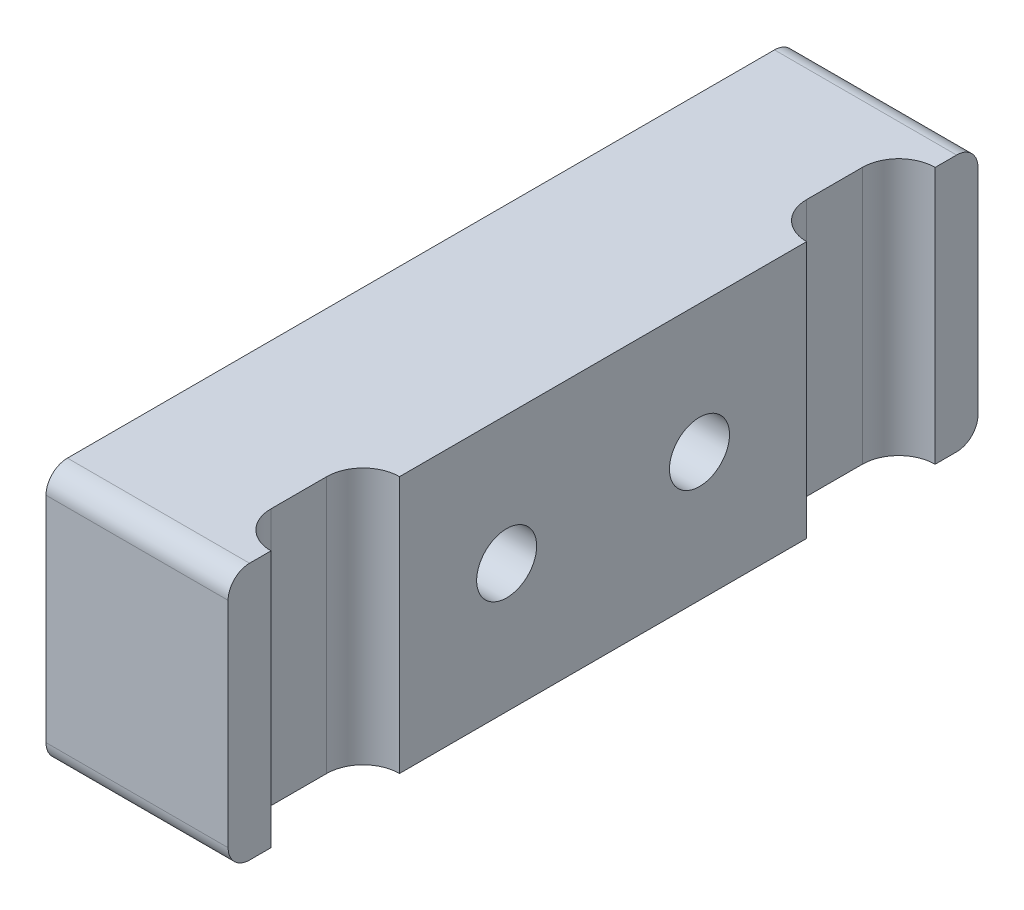
ISO-10303-21;
HEADER;
FILE_DESCRIPTION(('STEP AP214'),'2;1');
FILE_NAME('part.step','',(''),(''),'','','');
FILE_SCHEMA(('AUTOMOTIVE_DESIGN { 1 0 10303 214 1 1 1 1 }'));
ENDSEC;
DATA;
#1=APPLICATION_CONTEXT('core data for automotive mechanical design processes');
#2=APPLICATION_PROTOCOL_DEFINITION('international standard','automotive_design',2000,#1);
#3=PRODUCT_CONTEXT('',#1,'mechanical');
#4=PRODUCT('Part','Part','',(#3));
#5=PRODUCT_RELATED_PRODUCT_CATEGORY('part','',(#4));
#6=PRODUCT_DEFINITION_FORMATION('','',#4);
#7=PRODUCT_DEFINITION_CONTEXT('part definition',#1,'design');
#8=PRODUCT_DEFINITION('design','',#6,#7);
#9=PRODUCT_DEFINITION_SHAPE('','',#8);
#10=(LENGTH_UNIT() NAMED_UNIT(*) SI_UNIT(.MILLI.,.METRE.));
#11=(NAMED_UNIT(*) PLANE_ANGLE_UNIT() SI_UNIT($,.RADIAN.));
#12=(NAMED_UNIT(*) SI_UNIT($,.STERADIAN.) SOLID_ANGLE_UNIT());
#13=UNCERTAINTY_MEASURE_WITH_UNIT(LENGTH_MEASURE(1.E-05),#10,'distance_accuracy_value','');
#14=(GEOMETRIC_REPRESENTATION_CONTEXT(3) GLOBAL_UNCERTAINTY_ASSIGNED_CONTEXT((#13)) GLOBAL_UNIT_ASSIGNED_CONTEXT((#10,
#11,#12)) REPRESENTATION_CONTEXT('',''));
#15=CARTESIAN_POINT('',(0.,0.,0.));
#16=DIRECTION('',(0.,0.,1.));
#17=DIRECTION('',(1.,0.,0.));
#18=AXIS2_PLACEMENT_3D('',#15,#16,#17);
#19=CARTESIAN_POINT('',(0.,12.,-17.5));
#20=DIRECTION('',(1.,0.,0.));
#21=DIRECTION('',(0.,0.,-1.));
#22=AXIS2_PLACEMENT_3D('',#19,#20,#21);
#23=PLANE('',#22);
#24=CARTESIAN_POINT('',(0.,6.,4.5));
#25=DIRECTION('',(1.,0.,0.));
#26=DIRECTION('',(0.,0.,-1.));
#27=AXIS2_PLACEMENT_3D('',#24,#25,#26);
#28=CIRCLE('',#27,1.4);
#29=CARTESIAN_POINT('',(0.,6.,3.1));
#30=VERTEX_POINT('',#29);
#31=EDGE_CURVE('E194',#30,#30,#28,.F.);
#32=ORIENTED_EDGE('',*,*,#31,.F.);
#33=EDGE_LOOP('',(#32));
#34=FACE_BOUND('',#33,.T.);
#35=CARTESIAN_POINT('',(0.,6.,-4.5));
#36=DIRECTION('',(1.,0.,0.));
#37=DIRECTION('',(0.,0.,-1.));
#38=AXIS2_PLACEMENT_3D('',#35,#36,#37);
#39=CIRCLE('',#38,1.4);
#40=CARTESIAN_POINT('',(0.,6.,-5.9));
#41=VERTEX_POINT('',#40);
#42=EDGE_CURVE('E363',#41,#41,#39,.F.);
#43=ORIENTED_EDGE('',*,*,#42,.F.);
#44=EDGE_LOOP('',(#43));
#45=FACE_BOUND('',#44,.T.);
#46=DIRECTION('',(0.,0.,1.));
#47=VECTOR('',#46,1.);
#48=CARTESIAN_POINT('',(0.,12.,-17.5));
#49=LINE('',#48,#47);
#50=CARTESIAN_POINT('',(0.,12.,-16.5));
#51=VERTEX_POINT('',#50);
#52=CARTESIAN_POINT('',(0.,12.,16.5));
#53=VERTEX_POINT('',#52);
#54=EDGE_CURVE('E158',#51,#53,#49,.T.);
#55=ORIENTED_EDGE('',*,*,#54,.F.);
#56=CARTESIAN_POINT('',(0.,11.,-16.5));
#57=DIRECTION('',(1.,0.,0.));
#58=DIRECTION('',(0.,0.,-1.));
#59=AXIS2_PLACEMENT_3D('',#56,#57,#58);
#60=CIRCLE('',#59,1.);
#61=CARTESIAN_POINT('',(0.,11.,-17.5));
#62=VERTEX_POINT('',#61);
#63=EDGE_CURVE('E251',#51,#62,#60,.F.);
#64=ORIENTED_EDGE('',*,*,#63,.T.);
#65=DIRECTION('',(0.,-1.,0.));
#66=VECTOR('',#65,1.);
#67=CARTESIAN_POINT('',(0.,12.,-17.5));
#68=LINE('',#67,#66);
#69=CARTESIAN_POINT('',(0.,1.,-17.5));
#70=VERTEX_POINT('',#69);
#71=EDGE_CURVE('E190',#62,#70,#68,.T.);
#72=ORIENTED_EDGE('',*,*,#71,.T.);
#73=CARTESIAN_POINT('',(0.,1.,-16.5));
#74=DIRECTION('',(1.,0.,0.));
#75=DIRECTION('',(0.,0.,-1.));
#76=AXIS2_PLACEMENT_3D('',#73,#74,#75);
#77=CIRCLE('',#76,1.);
#78=CARTESIAN_POINT('',(0.,0.,-16.5));
#79=VERTEX_POINT('',#78);
#80=EDGE_CURVE('E249',#70,#79,#77,.F.);
#81=ORIENTED_EDGE('',*,*,#80,.T.);
#82=DIRECTION('',(0.,0.,1.));
#83=VECTOR('',#82,1.);
#84=CARTESIAN_POINT('',(0.,0.,-17.5));
#85=LINE('',#84,#83);
#86=CARTESIAN_POINT('',(0.,0.,16.5));
#87=VERTEX_POINT('',#86);
#88=EDGE_CURVE('E191',#79,#87,#85,.T.);
#89=ORIENTED_EDGE('',*,*,#88,.T.);
#90=CARTESIAN_POINT('',(0.,1.,16.5));
#91=DIRECTION('',(1.,0.,0.));
#92=DIRECTION('',(0.,0.,-1.));
#93=AXIS2_PLACEMENT_3D('',#90,#91,#92);
#94=CIRCLE('',#93,1.);
#95=CARTESIAN_POINT('',(0.,1.,17.5));
#96=VERTEX_POINT('',#95);
#97=EDGE_CURVE('E247',#87,#96,#94,.F.);
#98=ORIENTED_EDGE('',*,*,#97,.T.);
#99=DIRECTION('',(0.,-1.,0.));
#100=VECTOR('',#99,1.);
#101=CARTESIAN_POINT('',(0.,12.,17.5));
#102=LINE('',#101,#100);
#103=CARTESIAN_POINT('',(0.,11.,17.5));
#104=VERTEX_POINT('',#103);
#105=EDGE_CURVE('E238',#104,#96,#102,.T.);
#106=ORIENTED_EDGE('',*,*,#105,.F.);
#107=CARTESIAN_POINT('',(0.,11.,16.5));
#108=DIRECTION('',(1.,0.,0.));
#109=DIRECTION('',(0.,0.,-1.));
#110=AXIS2_PLACEMENT_3D('',#107,#108,#109);
#111=CIRCLE('',#110,1.);
#112=EDGE_CURVE('E245',#104,#53,#111,.F.);
#113=ORIENTED_EDGE('',*,*,#112,.T.);
#114=EDGE_LOOP('',(#55,#64,#72,#81,#89,#98,#106,#113));
#115=FACE_BOUND('',#114,.T.);
#116=ADVANCED_FACE('F37',(#34,#45,#115),#23,.F.);
#117=CARTESIAN_POINT('',(0.,12.,17.5));
#118=DIRECTION('',(0.,0.,-1.));
#119=DIRECTION('',(-1.,0.,0.));
#120=AXIS2_PLACEMENT_3D('',#117,#118,#119);
#121=PLANE('',#120);
#122=ORIENTED_EDGE('',*,*,#105,.T.);
#123=DIRECTION('',(1.,0.,0.));
#124=VECTOR('',#123,1.);
#125=CARTESIAN_POINT('',(0.,1.,17.5));
#126=LINE('',#125,#124);
#127=CARTESIAN_POINT('',(8.5,1.,17.5));
#128=VERTEX_POINT('',#127);
#129=EDGE_CURVE('E268',#96,#128,#126,.T.);
#130=ORIENTED_EDGE('',*,*,#129,.T.);
#131=DIRECTION('',(0.,-1.,0.));
#132=VECTOR('',#131,1.);
#133=CARTESIAN_POINT('',(8.5,12.,17.5));
#134=LINE('',#133,#132);
#135=CARTESIAN_POINT('',(8.5,11.,17.5));
#136=VERTEX_POINT('',#135);
#137=EDGE_CURVE('E167',#136,#128,#134,.T.);
#138=ORIENTED_EDGE('',*,*,#137,.F.);
#139=DIRECTION('',(1.,0.,0.));
#140=VECTOR('',#139,1.);
#141=CARTESIAN_POINT('',(0.,11.,17.5));
#142=LINE('',#141,#140);
#143=EDGE_CURVE('E266',#136,#104,#142,.F.);
#144=ORIENTED_EDGE('',*,*,#143,.T.);
#145=EDGE_LOOP('',(#122,#130,#138,#144));
#146=FACE_BOUND('',#145,.T.);
#147=ADVANCED_FACE('F270',(#146),#121,.F.);
#148=CARTESIAN_POINT('',(8.5,12.,15.5));
#149=DIRECTION('',(-1.,0.,0.));
#150=DIRECTION('',(0.,0.,1.));
#151=AXIS2_PLACEMENT_3D('',#148,#149,#150);
#152=PLANE('',#151);
#153=ORIENTED_EDGE('',*,*,#137,.T.);
#154=CARTESIAN_POINT('',(8.5,1.,16.5));
#155=DIRECTION('',(-1.,0.,0.));
#156=DIRECTION('',(0.,0.,1.));
#157=AXIS2_PLACEMENT_3D('',#154,#155,#156);
#158=CIRCLE('',#157,1.);
#159=CARTESIAN_POINT('',(8.5,0.,16.5));
#160=VERTEX_POINT('',#159);
#161=EDGE_CURVE('E11',#128,#160,#158,.F.);
#162=ORIENTED_EDGE('',*,*,#161,.T.);
#163=DIRECTION('',(0.,0.,-1.));
#164=VECTOR('',#163,1.);
#165=CARTESIAN_POINT('',(8.5,0.,15.5));
#166=LINE('',#165,#164);
#167=CARTESIAN_POINT('',(8.5,0.,15.5));
#168=VERTEX_POINT('',#167);
#169=EDGE_CURVE('E164',#160,#168,#166,.T.);
#170=ORIENTED_EDGE('',*,*,#169,.T.);
#171=DIRECTION('',(0.,-1.,0.));
#172=VECTOR('',#171,1.);
#173=CARTESIAN_POINT('',(8.5,12.,15.5));
#174=LINE('',#173,#172);
#175=CARTESIAN_POINT('',(8.5,12.,15.5));
#176=VERTEX_POINT('',#175);
#177=EDGE_CURVE('E161',#176,#168,#174,.T.);
#178=ORIENTED_EDGE('',*,*,#177,.F.);
#179=DIRECTION('',(0.,0.,-1.));
#180=VECTOR('',#179,1.);
#181=CARTESIAN_POINT('',(8.5,12.,15.5));
#182=LINE('',#181,#180);
#183=CARTESIAN_POINT('',(8.5,12.,16.5));
#184=VERTEX_POINT('',#183);
#185=EDGE_CURVE('E148',#184,#176,#182,.T.);
#186=ORIENTED_EDGE('',*,*,#185,.F.);
#187=CARTESIAN_POINT('',(8.5,11.,16.5));
#188=DIRECTION('',(-1.,0.,0.));
#189=DIRECTION('',(0.,0.,1.));
#190=AXIS2_PLACEMENT_3D('',#187,#188,#189);
#191=CIRCLE('',#190,1.);
#192=EDGE_CURVE('E45',#184,#136,#191,.F.);
#193=ORIENTED_EDGE('',*,*,#192,.T.);
#194=EDGE_LOOP('',(#153,#162,#170,#178,#186,#193));
#195=FACE_BOUND('',#194,.T.);
#196=ADVANCED_FACE('F162',(#195),#152,.F.);
#197=CARTESIAN_POINT('',(8.5,12.,13.8));
#198=DIRECTION('',(0.,-1.,0.));
#199=DIRECTION('',(0.,0.,-1.));
#200=AXIS2_PLACEMENT_3D('',#197,#198,#199);
#201=CYLINDRICAL_SURFACE('',#200,1.7);
#202=CARTESIAN_POINT('',(8.5,0.,13.8));
#203=DIRECTION('',(0.,-1.,0.));
#204=DIRECTION('',(0.,0.,1.));
#205=AXIS2_PLACEMENT_3D('',#202,#203,#204);
#206=CIRCLE('',#205,1.7);
#207=CARTESIAN_POINT('',(6.8,0.,13.8));
#208=VERTEX_POINT('',#207);
#209=EDGE_CURVE('E196',#168,#208,#206,.T.);
#210=ORIENTED_EDGE('',*,*,#209,.T.);
#211=DIRECTION('',(0.,-1.,0.));
#212=VECTOR('',#211,1.);
#213=CARTESIAN_POINT('',(6.8,12.,13.8));
#214=LINE('',#213,#212);
#215=CARTESIAN_POINT('',(6.8,12.,13.8));
#216=VERTEX_POINT('',#215);
#217=EDGE_CURVE('E168',#216,#208,#214,.T.);
#218=ORIENTED_EDGE('',*,*,#217,.F.);
#219=CARTESIAN_POINT('',(8.5,12.,13.8));
#220=DIRECTION('',(0.,-1.,0.));
#221=DIRECTION('',(0.,0.,1.));
#222=AXIS2_PLACEMENT_3D('',#219,#220,#221);
#223=CIRCLE('',#222,1.7);
#224=EDGE_CURVE('E153',#176,#216,#223,.T.);
#225=ORIENTED_EDGE('',*,*,#224,.F.);
#226=ORIENTED_EDGE('',*,*,#177,.T.);
#227=EDGE_LOOP('',(#210,#218,#225,#226));
#228=FACE_BOUND('',#227,.T.);
#229=ADVANCED_FACE('F170',(#228),#201,.F.);
#230=CARTESIAN_POINT('',(6.8,12.,13.8));
#231=DIRECTION('',(-1.,0.,0.));
#232=DIRECTION('',(0.,0.,1.));
#233=AXIS2_PLACEMENT_3D('',#230,#231,#232);
#234=PLANE('',#233);
#235=DIRECTION('',(0.,0.,-1.));
#236=VECTOR('',#235,1.);
#237=CARTESIAN_POINT('',(6.8,0.,13.8));
#238=LINE('',#237,#236);
#239=CARTESIAN_POINT('',(6.8,0.,11.2));
#240=VERTEX_POINT('',#239);
#241=EDGE_CURVE('E198',#208,#240,#238,.T.);
#242=ORIENTED_EDGE('',*,*,#241,.T.);
#243=DIRECTION('',(0.,-1.,0.));
#244=VECTOR('',#243,1.);
#245=CARTESIAN_POINT('',(6.8,12.,11.2));
#246=LINE('',#245,#244);
#247=CARTESIAN_POINT('',(6.8,12.,11.2));
#248=VERTEX_POINT('',#247);
#249=EDGE_CURVE('E233',#248,#240,#246,.T.);
#250=ORIENTED_EDGE('',*,*,#249,.F.);
#251=DIRECTION('',(0.,0.,-1.));
#252=VECTOR('',#251,1.);
#253=CARTESIAN_POINT('',(6.8,12.,13.8));
#254=LINE('',#253,#252);
#255=EDGE_CURVE('E173',#216,#248,#254,.T.);
#256=ORIENTED_EDGE('',*,*,#255,.F.);
#257=ORIENTED_EDGE('',*,*,#217,.T.);
#258=EDGE_LOOP('',(#242,#250,#256,#257));
#259=FACE_BOUND('',#258,.T.);
#260=ADVANCED_FACE('F327',(#259),#234,.F.);
#261=CARTESIAN_POINT('',(8.5,12.,11.2));
#262=DIRECTION('',(0.,-1.,0.));
#263=DIRECTION('',(0.,0.,-1.));
#264=AXIS2_PLACEMENT_3D('',#261,#262,#263);
#265=CYLINDRICAL_SURFACE('',#264,1.7);
#266=CARTESIAN_POINT('',(8.5,0.,11.2));
#267=DIRECTION('',(0.,-1.,0.));
#268=DIRECTION('',(0.,0.,-1.));
#269=AXIS2_PLACEMENT_3D('',#266,#267,#268);
#270=CIRCLE('',#269,1.7);
#271=CARTESIAN_POINT('',(8.5,0.,9.5));
#272=VERTEX_POINT('',#271);
#273=EDGE_CURVE('E200',#240,#272,#270,.T.);
#274=ORIENTED_EDGE('',*,*,#273,.T.);
#275=DIRECTION('',(0.,-1.,0.));
#276=VECTOR('',#275,1.);
#277=CARTESIAN_POINT('',(8.5,12.,9.5));
#278=LINE('',#277,#276);
#279=CARTESIAN_POINT('',(8.5,12.,9.5));
#280=VERTEX_POINT('',#279);
#281=EDGE_CURVE('E230',#280,#272,#278,.T.);
#282=ORIENTED_EDGE('',*,*,#281,.F.);
#283=CARTESIAN_POINT('',(8.5,12.,11.2));
#284=DIRECTION('',(0.,-1.,0.));
#285=DIRECTION('',(0.,0.,-1.));
#286=AXIS2_PLACEMENT_3D('',#283,#284,#285);
#287=CIRCLE('',#286,1.7);
#288=EDGE_CURVE('E175',#248,#280,#287,.T.);
#289=ORIENTED_EDGE('',*,*,#288,.F.);
#290=ORIENTED_EDGE('',*,*,#249,.T.);
#291=EDGE_LOOP('',(#274,#282,#289,#290));
#292=FACE_BOUND('',#291,.T.);
#293=ADVANCED_FACE('F323',(#292),#265,.F.);
#294=CARTESIAN_POINT('',(8.5,12.,-9.5));
#295=DIRECTION('',(-1.,0.,0.));
#296=DIRECTION('',(0.,0.,1.));
#297=AXIS2_PLACEMENT_3D('',#294,#295,#296);
#298=PLANE('',#297);
#299=CARTESIAN_POINT('',(8.5,6.,4.5));
#300=DIRECTION('',(1.,0.,0.));
#301=DIRECTION('',(0.,0.,-1.));
#302=AXIS2_PLACEMENT_3D('',#299,#300,#301);
#303=CIRCLE('',#302,1.4);
#304=CARTESIAN_POINT('',(8.5,6.,3.1));
#305=VERTEX_POINT('',#304);
#306=EDGE_CURVE('E362',#305,#305,#303,.T.);
#307=ORIENTED_EDGE('',*,*,#306,.F.);
#308=EDGE_LOOP('',(#307));
#309=FACE_BOUND('',#308,.T.);
#310=CARTESIAN_POINT('',(8.5,6.,-4.5));
#311=DIRECTION('',(1.,0.,0.));
#312=DIRECTION('',(0.,0.,1.));
#313=AXIS2_PLACEMENT_3D('',#310,#311,#312);
#314=CIRCLE('',#313,1.4);
#315=CARTESIAN_POINT('',(8.5,6.,-3.1));
#316=VERTEX_POINT('',#315);
#317=EDGE_CURVE('E359',#316,#316,#314,.T.);
#318=ORIENTED_EDGE('',*,*,#317,.F.);
#319=EDGE_LOOP('',(#318));
#320=FACE_BOUND('',#319,.T.);
#321=DIRECTION('',(0.,0.,-1.));
#322=VECTOR('',#321,1.);
#323=CARTESIAN_POINT('',(8.5,0.,-9.5));
#324=LINE('',#323,#322);
#325=CARTESIAN_POINT('',(8.5,0.,-9.5));
#326=VERTEX_POINT('',#325);
#327=EDGE_CURVE('E202',#272,#326,#324,.T.);
#328=ORIENTED_EDGE('',*,*,#327,.T.);
#329=DIRECTION('',(0.,-1.,0.));
#330=VECTOR('',#329,1.);
#331=CARTESIAN_POINT('',(8.5,12.,-9.5));
#332=LINE('',#331,#330);
#333=CARTESIAN_POINT('',(8.5,12.,-9.5));
#334=VERTEX_POINT('',#333);
#335=EDGE_CURVE('E227',#334,#326,#332,.T.);
#336=ORIENTED_EDGE('',*,*,#335,.F.);
#337=DIRECTION('',(0.,0.,-1.));
#338=VECTOR('',#337,1.);
#339=CARTESIAN_POINT('',(8.5,12.,-9.5));
#340=LINE('',#339,#338);
#341=EDGE_CURVE('E180',#280,#334,#340,.T.);
#342=ORIENTED_EDGE('',*,*,#341,.F.);
#343=ORIENTED_EDGE('',*,*,#281,.T.);
#344=EDGE_LOOP('',(#328,#336,#342,#343));
#345=FACE_BOUND('',#344,.T.);
#346=ADVANCED_FACE('F319',(#309,#320,#345),#298,.F.);
#347=CARTESIAN_POINT('',(8.5,12.,-11.2));
#348=DIRECTION('',(0.,-1.,0.));
#349=DIRECTION('',(0.,0.,-1.));
#350=AXIS2_PLACEMENT_3D('',#347,#348,#349);
#351=CYLINDRICAL_SURFACE('',#350,1.7);
#352=CARTESIAN_POINT('',(8.5,0.,-11.2));
#353=DIRECTION('',(0.,-1.,0.));
#354=DIRECTION('',(0.,0.,1.));
#355=AXIS2_PLACEMENT_3D('',#352,#353,#354);
#356=CIRCLE('',#355,1.7);
#357=CARTESIAN_POINT('',(6.8,0.,-11.2));
#358=VERTEX_POINT('',#357);
#359=EDGE_CURVE('E204',#326,#358,#356,.T.);
#360=ORIENTED_EDGE('',*,*,#359,.T.);
#361=DIRECTION('',(0.,-1.,0.));
#362=VECTOR('',#361,1.);
#363=CARTESIAN_POINT('',(6.8,12.,-11.2));
#364=LINE('',#363,#362);
#365=CARTESIAN_POINT('',(6.8,12.,-11.2));
#366=VERTEX_POINT('',#365);
#367=EDGE_CURVE('E224',#366,#358,#364,.T.);
#368=ORIENTED_EDGE('',*,*,#367,.F.);
#369=CARTESIAN_POINT('',(8.5,12.,-11.2));
#370=DIRECTION('',(0.,-1.,0.));
#371=DIRECTION('',(0.,0.,1.));
#372=AXIS2_PLACEMENT_3D('',#369,#370,#371);
#373=CIRCLE('',#372,1.7);
#374=EDGE_CURVE('E182',#334,#366,#373,.T.);
#375=ORIENTED_EDGE('',*,*,#374,.F.);
#376=ORIENTED_EDGE('',*,*,#335,.T.);
#377=EDGE_LOOP('',(#360,#368,#375,#376));
#378=FACE_BOUND('',#377,.T.);
#379=ADVANCED_FACE('F315',(#378),#351,.F.);
#380=CARTESIAN_POINT('',(6.8,12.,-11.2));
#381=DIRECTION('',(-1.,0.,0.));
#382=DIRECTION('',(0.,0.,1.));
#383=AXIS2_PLACEMENT_3D('',#380,#381,#382);
#384=PLANE('',#383);
#385=DIRECTION('',(0.,0.,-1.));
#386=VECTOR('',#385,1.);
#387=CARTESIAN_POINT('',(6.8,0.,-11.2));
#388=LINE('',#387,#386);
#389=CARTESIAN_POINT('',(6.8,0.,-13.8));
#390=VERTEX_POINT('',#389);
#391=EDGE_CURVE('E206',#358,#390,#388,.T.);
#392=ORIENTED_EDGE('',*,*,#391,.T.);
#393=DIRECTION('',(0.,-1.,0.));
#394=VECTOR('',#393,1.);
#395=CARTESIAN_POINT('',(6.8,12.,-13.8));
#396=LINE('',#395,#394);
#397=CARTESIAN_POINT('',(6.8,12.,-13.8));
#398=VERTEX_POINT('',#397);
#399=EDGE_CURVE('E221',#398,#390,#396,.T.);
#400=ORIENTED_EDGE('',*,*,#399,.F.);
#401=DIRECTION('',(0.,0.,-1.));
#402=VECTOR('',#401,1.);
#403=CARTESIAN_POINT('',(6.8,12.,-11.2));
#404=LINE('',#403,#402);
#405=EDGE_CURVE('E184',#366,#398,#404,.T.);
#406=ORIENTED_EDGE('',*,*,#405,.F.);
#407=ORIENTED_EDGE('',*,*,#367,.T.);
#408=EDGE_LOOP('',(#392,#400,#406,#407));
#409=FACE_BOUND('',#408,.T.);
#410=ADVANCED_FACE('F311',(#409),#384,.F.);
#411=CARTESIAN_POINT('',(8.5,12.,-13.8));
#412=DIRECTION('',(0.,-1.,0.));
#413=DIRECTION('',(0.,0.,-1.));
#414=AXIS2_PLACEMENT_3D('',#411,#412,#413);
#415=CYLINDRICAL_SURFACE('',#414,1.7);
#416=CARTESIAN_POINT('',(8.5,0.,-13.8));
#417=DIRECTION('',(0.,-1.,0.));
#418=DIRECTION('',(0.,0.,-1.));
#419=AXIS2_PLACEMENT_3D('',#416,#417,#418);
#420=CIRCLE('',#419,1.7);
#421=CARTESIAN_POINT('',(8.5,0.,-15.5));
#422=VERTEX_POINT('',#421);
#423=EDGE_CURVE('E208',#390,#422,#420,.T.);
#424=ORIENTED_EDGE('',*,*,#423,.T.);
#425=DIRECTION('',(0.,-1.,0.));
#426=VECTOR('',#425,1.);
#427=CARTESIAN_POINT('',(8.5,12.,-15.5));
#428=LINE('',#427,#426);
#429=CARTESIAN_POINT('',(8.5,12.,-15.5));
#430=VERTEX_POINT('',#429);
#431=EDGE_CURVE('E218',#430,#422,#428,.T.);
#432=ORIENTED_EDGE('',*,*,#431,.F.);
#433=CARTESIAN_POINT('',(8.5,12.,-13.8));
#434=DIRECTION('',(0.,-1.,0.));
#435=DIRECTION('',(0.,0.,-1.));
#436=AXIS2_PLACEMENT_3D('',#433,#434,#435);
#437=CIRCLE('',#436,1.7);
#438=EDGE_CURVE('E186',#398,#430,#437,.T.);
#439=ORIENTED_EDGE('',*,*,#438,.F.);
#440=ORIENTED_EDGE('',*,*,#399,.T.);
#441=EDGE_LOOP('',(#424,#432,#439,#440));
#442=FACE_BOUND('',#441,.T.);
#443=ADVANCED_FACE('F305',(#442),#415,.F.);
#444=CARTESIAN_POINT('',(8.5,12.,-17.5));
#445=DIRECTION('',(-1.,0.,0.));
#446=DIRECTION('',(0.,0.,1.));
#447=AXIS2_PLACEMENT_3D('',#444,#445,#446);
#448=PLANE('',#447);
#449=DIRECTION('',(0.,-1.,0.));
#450=VECTOR('',#449,1.);
#451=CARTESIAN_POINT('',(8.5,12.,-17.5));
#452=LINE('',#451,#450);
#453=CARTESIAN_POINT('',(8.5,11.,-17.5));
#454=VERTEX_POINT('',#453);
#455=CARTESIAN_POINT('',(8.5,1.,-17.5));
#456=VERTEX_POINT('',#455);
#457=EDGE_CURVE('E215',#454,#456,#452,.T.);
#458=ORIENTED_EDGE('',*,*,#457,.F.);
#459=CARTESIAN_POINT('',(8.5,11.,-16.5));
#460=DIRECTION('',(-1.,0.,0.));
#461=DIRECTION('',(0.,0.,1.));
#462=AXIS2_PLACEMENT_3D('',#459,#460,#461);
#463=CIRCLE('',#462,1.);
#464=CARTESIAN_POINT('',(8.5,12.,-16.5));
#465=VERTEX_POINT('',#464);
#466=EDGE_CURVE('E260',#454,#465,#463,.F.);
#467=ORIENTED_EDGE('',*,*,#466,.T.);
#468=DIRECTION('',(0.,0.,-1.));
#469=VECTOR('',#468,1.);
#470=CARTESIAN_POINT('',(8.5,12.,-17.5));
#471=LINE('',#470,#469);
#472=EDGE_CURVE('E188',#430,#465,#471,.T.);
#473=ORIENTED_EDGE('',*,*,#472,.F.);
#474=ORIENTED_EDGE('',*,*,#431,.T.);
#475=DIRECTION('',(0.,0.,-1.));
#476=VECTOR('',#475,1.);
#477=CARTESIAN_POINT('',(8.5,0.,-17.5));
#478=LINE('',#477,#476);
#479=CARTESIAN_POINT('',(8.5,0.,-16.5));
#480=VERTEX_POINT('',#479);
#481=EDGE_CURVE('E210',#422,#480,#478,.T.);
#482=ORIENTED_EDGE('',*,*,#481,.T.);
#483=CARTESIAN_POINT('',(8.5,1.,-16.5));
#484=DIRECTION('',(-1.,0.,0.));
#485=DIRECTION('',(0.,0.,1.));
#486=AXIS2_PLACEMENT_3D('',#483,#484,#485);
#487=CIRCLE('',#486,1.);
#488=EDGE_CURVE('E258',#480,#456,#487,.F.);
#489=ORIENTED_EDGE('',*,*,#488,.T.);
#490=EDGE_LOOP('',(#458,#467,#473,#474,#482,#489));
#491=FACE_BOUND('',#490,.T.);
#492=ADVANCED_FACE('F290',(#491),#448,.F.);
#493=CARTESIAN_POINT('',(0.,12.,-17.5));
#494=DIRECTION('',(0.,0.,1.));
#495=DIRECTION('',(1.,0.,0.));
#496=AXIS2_PLACEMENT_3D('',#493,#494,#495);
#497=PLANE('',#496);
#498=ORIENTED_EDGE('',*,*,#71,.F.);
#499=DIRECTION('',(-1.,0.,0.));
#500=VECTOR('',#499,1.);
#501=CARTESIAN_POINT('',(8.5,11.,-17.5));
#502=LINE('',#501,#500);
#503=EDGE_CURVE('E256',#62,#454,#502,.F.);
#504=ORIENTED_EDGE('',*,*,#503,.T.);
#505=ORIENTED_EDGE('',*,*,#457,.T.);
#506=DIRECTION('',(-1.,0.,0.));
#507=VECTOR('',#506,1.);
#508=CARTESIAN_POINT('',(0.,1.,-17.5));
#509=LINE('',#508,#507);
#510=EDGE_CURVE('E253',#456,#70,#509,.T.);
#511=ORIENTED_EDGE('',*,*,#510,.T.);
#512=EDGE_LOOP('',(#498,#504,#505,#511));
#513=FACE_BOUND('',#512,.T.);
#514=ADVANCED_FACE('F294',(#513),#497,.F.);
#515=CARTESIAN_POINT('',(8.5,12.,13.8));
#516=DIRECTION('',(0.,1.,0.));
#517=DIRECTION('',(0.,0.,1.));
#518=AXIS2_PLACEMENT_3D('',#515,#516,#517);
#519=PLANE('',#518);
#520=ORIENTED_EDGE('',*,*,#472,.T.);
#521=DIRECTION('',(-1.,0.,0.));
#522=VECTOR('',#521,1.);
#523=CARTESIAN_POINT('',(0.,12.,-16.5));
#524=LINE('',#523,#522);
#525=EDGE_CURVE('E242',#465,#51,#524,.T.);
#526=ORIENTED_EDGE('',*,*,#525,.T.);
#527=ORIENTED_EDGE('',*,*,#54,.T.);
#528=DIRECTION('',(1.,0.,0.));
#529=VECTOR('',#528,1.);
#530=CARTESIAN_POINT('',(8.5,12.,16.5));
#531=LINE('',#530,#529);
#532=EDGE_CURVE('E157',#53,#184,#531,.T.);
#533=ORIENTED_EDGE('',*,*,#532,.T.);
#534=ORIENTED_EDGE('',*,*,#185,.T.);
#535=ORIENTED_EDGE('',*,*,#224,.T.);
#536=ORIENTED_EDGE('',*,*,#255,.T.);
#537=ORIENTED_EDGE('',*,*,#288,.T.);
#538=ORIENTED_EDGE('',*,*,#341,.T.);
#539=ORIENTED_EDGE('',*,*,#374,.T.);
#540=ORIENTED_EDGE('',*,*,#405,.T.);
#541=ORIENTED_EDGE('',*,*,#438,.T.);
#542=EDGE_LOOP('',(#520,#526,#527,#533,#534,#535,#536,#537,#538,#539,#540,#541));
#543=FACE_BOUND('',#542,.T.);
#544=ADVANCED_FACE('F151',(#543),#519,.T.);
#545=CARTESIAN_POINT('',(8.5,0.,13.8));
#546=DIRECTION('',(0.,1.,0.));
#547=DIRECTION('',(0.,0.,1.));
#548=AXIS2_PLACEMENT_3D('',#545,#546,#547);
#549=PLANE('',#548);
#550=ORIENTED_EDGE('',*,*,#88,.F.);
#551=DIRECTION('',(-1.,0.,0.));
#552=VECTOR('',#551,1.);
#553=CARTESIAN_POINT('',(8.5,0.,-16.5));
#554=LINE('',#553,#552);
#555=EDGE_CURVE('E264',#79,#480,#554,.F.);
#556=ORIENTED_EDGE('',*,*,#555,.T.);
#557=ORIENTED_EDGE('',*,*,#481,.F.);
#558=ORIENTED_EDGE('',*,*,#423,.F.);
#559=ORIENTED_EDGE('',*,*,#391,.F.);
#560=ORIENTED_EDGE('',*,*,#359,.F.);
#561=ORIENTED_EDGE('',*,*,#327,.F.);
#562=ORIENTED_EDGE('',*,*,#273,.F.);
#563=ORIENTED_EDGE('',*,*,#241,.F.);
#564=ORIENTED_EDGE('',*,*,#209,.F.);
#565=ORIENTED_EDGE('',*,*,#169,.F.);
#566=DIRECTION('',(1.,0.,0.));
#567=VECTOR('',#566,1.);
#568=CARTESIAN_POINT('',(8.5,0.,16.5));
#569=LINE('',#568,#567);
#570=EDGE_CURVE('E262',#160,#87,#569,.F.);
#571=ORIENTED_EDGE('',*,*,#570,.T.);
#572=EDGE_LOOP('',(#550,#556,#557,#558,#559,#560,#561,#562,#563,#564,#565,#571));
#573=FACE_BOUND('',#572,.T.);
#574=ADVANCED_FACE('F276',(#573),#549,.F.);
#575=CARTESIAN_POINT('',(-0.000999999999999265,6.,-4.5));
#576=DIRECTION('',(1.,0.,0.));
#577=DIRECTION('',(0.,0.,-1.));
#578=AXIS2_PLACEMENT_3D('',#575,#576,#577);
#579=CYLINDRICAL_SURFACE('',#578,1.4);
#580=ORIENTED_EDGE('',*,*,#317,.T.);
#581=EDGE_LOOP('',(#580));
#582=FACE_BOUND('',#581,.T.);
#583=ORIENTED_EDGE('',*,*,#42,.T.);
#584=EDGE_LOOP('',(#583));
#585=FACE_BOUND('',#584,.T.);
#586=ADVANCED_FACE('F378',(#582,#585),#579,.F.);
#587=CARTESIAN_POINT('',(-0.000999999999999265,6.,4.5));
#588=DIRECTION('',(1.,0.,0.));
#589=DIRECTION('',(0.,0.,-1.));
#590=AXIS2_PLACEMENT_3D('',#587,#588,#589);
#591=CYLINDRICAL_SURFACE('',#590,1.4);
#592=ORIENTED_EDGE('',*,*,#306,.T.);
#593=EDGE_LOOP('',(#592));
#594=FACE_BOUND('',#593,.T.);
#595=ORIENTED_EDGE('',*,*,#31,.T.);
#596=EDGE_LOOP('',(#595));
#597=FACE_BOUND('',#596,.T.);
#598=ADVANCED_FACE('F349',(#594,#597),#591,.F.);
#599=CARTESIAN_POINT('',(8.5,11.,-16.5));
#600=DIRECTION('',(1.,0.,0.));
#601=DIRECTION('',(0.,0.,-1.));
#602=AXIS2_PLACEMENT_3D('',#599,#600,#601);
#603=CYLINDRICAL_SURFACE('',#602,1.);
#604=ORIENTED_EDGE('',*,*,#466,.F.);
#605=ORIENTED_EDGE('',*,*,#503,.F.);
#606=ORIENTED_EDGE('',*,*,#63,.F.);
#607=ORIENTED_EDGE('',*,*,#525,.F.);
#608=EDGE_LOOP('',(#604,#605,#606,#607));
#609=FACE_BOUND('',#608,.T.);
#610=ADVANCED_FACE('F297',(#609),#603,.T.);
#611=CARTESIAN_POINT('',(0.,1.,-16.5));
#612=DIRECTION('',(-1.,0.,0.));
#613=DIRECTION('',(0.,0.,1.));
#614=AXIS2_PLACEMENT_3D('',#611,#612,#613);
#615=CYLINDRICAL_SURFACE('',#614,1.);
#616=ORIENTED_EDGE('',*,*,#488,.F.);
#617=ORIENTED_EDGE('',*,*,#555,.F.);
#618=ORIENTED_EDGE('',*,*,#80,.F.);
#619=ORIENTED_EDGE('',*,*,#510,.F.);
#620=EDGE_LOOP('',(#616,#617,#618,#619));
#621=FACE_BOUND('',#620,.T.);
#622=ADVANCED_FACE('F286',(#621),#615,.T.);
#623=CARTESIAN_POINT('',(0.,1.,16.5));
#624=DIRECTION('',(1.,0.,0.));
#625=DIRECTION('',(0.,0.,-1.));
#626=AXIS2_PLACEMENT_3D('',#623,#624,#625);
#627=CYLINDRICAL_SURFACE('',#626,1.);
#628=ORIENTED_EDGE('',*,*,#97,.F.);
#629=ORIENTED_EDGE('',*,*,#570,.F.);
#630=ORIENTED_EDGE('',*,*,#161,.F.);
#631=ORIENTED_EDGE('',*,*,#129,.F.);
#632=EDGE_LOOP('',(#628,#629,#630,#631));
#633=FACE_BOUND('',#632,.T.);
#634=ADVANCED_FACE('F278',(#633),#627,.T.);
#635=CARTESIAN_POINT('',(8.5,11.,16.5));
#636=DIRECTION('',(-1.,0.,0.));
#637=DIRECTION('',(0.,0.,1.));
#638=AXIS2_PLACEMENT_3D('',#635,#636,#637);
#639=CYLINDRICAL_SURFACE('',#638,1.);
#640=ORIENTED_EDGE('',*,*,#112,.F.);
#641=ORIENTED_EDGE('',*,*,#143,.F.);
#642=ORIENTED_EDGE('',*,*,#192,.F.);
#643=ORIENTED_EDGE('',*,*,#532,.F.);
#644=EDGE_LOOP('',(#640,#641,#642,#643));
#645=FACE_BOUND('',#644,.T.);
#646=ADVANCED_FACE('F39',(#645),#639,.T.);
#647=CLOSED_SHELL('',(#116,#147,#196,#229,#260,#293,#346,#379,#410,#443,#492,#514,#544,#574,
#586,#598,#610,#622,#634,#646));
#648=MANIFOLD_SOLID_BREP('B2',#647);
#649=ADVANCED_BREP_SHAPE_REPRESENTATION('',(#18,#648),#14);
#650=SHAPE_DEFINITION_REPRESENTATION(#9,#649);
ENDSEC;
END-ISO-10303-21;
